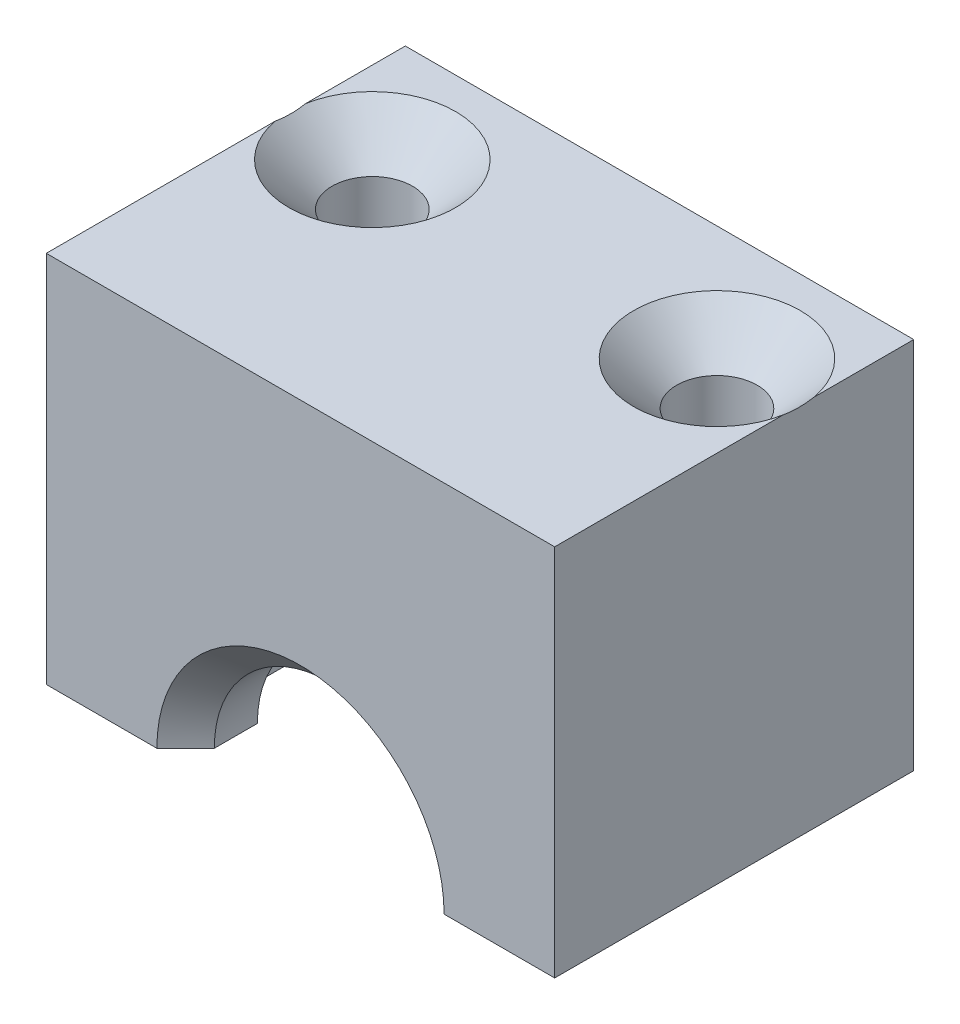
ISO-10303-21;
HEADER;
FILE_DESCRIPTION(('STEP AP214'),'2;1');
FILE_NAME('part.step','',(''),(''),'','','');
FILE_SCHEMA(('AUTOMOTIVE_DESIGN { 1 0 10303 214 1 1 1 1 }'));
ENDSEC;
DATA;
#1=APPLICATION_CONTEXT('core data for automotive mechanical design processes');
#2=APPLICATION_PROTOCOL_DEFINITION('international standard','automotive_design',2000,#1);
#3=PRODUCT_CONTEXT('',#1,'mechanical');
#4=PRODUCT('Part','Part','',(#3));
#5=PRODUCT_RELATED_PRODUCT_CATEGORY('part','',(#4));
#6=PRODUCT_DEFINITION_FORMATION('','',#4);
#7=PRODUCT_DEFINITION_CONTEXT('part definition',#1,'design');
#8=PRODUCT_DEFINITION('design','',#6,#7);
#9=PRODUCT_DEFINITION_SHAPE('','',#8);
#10=(LENGTH_UNIT() NAMED_UNIT(*) SI_UNIT(.MILLI.,.METRE.));
#11=(NAMED_UNIT(*) PLANE_ANGLE_UNIT() SI_UNIT($,.RADIAN.));
#12=(NAMED_UNIT(*) SI_UNIT($,.STERADIAN.) SOLID_ANGLE_UNIT());
#13=UNCERTAINTY_MEASURE_WITH_UNIT(LENGTH_MEASURE(1.E-05),#10,'distance_accuracy_value','');
#14=(GEOMETRIC_REPRESENTATION_CONTEXT(3) GLOBAL_UNCERTAINTY_ASSIGNED_CONTEXT((#13)) GLOBAL_UNIT_ASSIGNED_CONTEXT((#10,
#11,#12)) REPRESENTATION_CONTEXT('',''));
#15=CARTESIAN_POINT('',(0.,0.,0.));
#16=DIRECTION('',(0.,0.,1.));
#17=DIRECTION('',(1.,0.,0.));
#18=AXIS2_PLACEMENT_3D('',#15,#16,#17);
#19=CARTESIAN_POINT('',(-8.85,0.,6.25));
#20=DIRECTION('',(0.,1.,0.));
#21=DIRECTION('',(0.,0.,1.));
#22=AXIS2_PLACEMENT_3D('',#19,#20,#21);
#23=PLANE('',#22);
#24=CARTESIAN_POINT('',(-6.,0.,-2.25));
#25=DIRECTION('',(0.,1.,0.));
#26=DIRECTION('',(0.,0.,1.));
#27=AXIS2_PLACEMENT_3D('',#24,#25,#26);
#28=CIRCLE('',#27,1.4);
#29=CARTESIAN_POINT('',(-6.,0.,-0.85));
#30=VERTEX_POINT('',#29);
#31=EDGE_CURVE('E160',#30,#30,#28,.T.);
#32=ORIENTED_EDGE('',*,*,#31,.T.);
#33=EDGE_LOOP('',(#32));
#34=FACE_BOUND('',#33,.T.);
#35=DIRECTION('',(1.,0.,0.));
#36=VECTOR('',#35,1.);
#37=CARTESIAN_POINT('',(-8.85,0.,-6.25));
#38=LINE('',#37,#36);
#39=CARTESIAN_POINT('',(-8.85,0.,-6.25));
#40=VERTEX_POINT('',#39);
#41=CARTESIAN_POINT('',(-5.,0.,-6.25));
#42=VERTEX_POINT('',#41);
#43=EDGE_CURVE('E199',#40,#42,#38,.T.);
#44=ORIENTED_EDGE('',*,*,#43,.T.);
#45=DIRECTION('',(0.707106781186546,0.,0.707106781186549));
#46=VECTOR('',#45,1.);
#47=CARTESIAN_POINT('',(0.,0.,-1.24999999999999));
#48=LINE('',#47,#46);
#49=CARTESIAN_POINT('',(-4.,0.,-5.25));
#50=VERTEX_POINT('',#49);
#51=EDGE_CURVE('E226',#42,#50,#48,.T.);
#52=ORIENTED_EDGE('',*,*,#51,.T.);
#53=DIRECTION('',(0.,0.,1.));
#54=VECTOR('',#53,1.);
#55=CARTESIAN_POINT('',(-4.,0.,-6.25));
#56=LINE('',#55,#54);
#57=CARTESIAN_POINT('',(-4.,0.,-0.749999999999999));
#58=VERTEX_POINT('',#57);
#59=EDGE_CURVE('E180',#50,#58,#56,.T.);
#60=ORIENTED_EDGE('',*,*,#59,.T.);
#61=DIRECTION('',(1.,0.,0.));
#62=VECTOR('',#61,1.);
#63=CARTESIAN_POINT('',(-8.85,0.,-0.749999999999999));
#64=LINE('',#63,#62);
#65=CARTESIAN_POINT('',(-5.25,0.,-0.749999999999999));
#66=VERTEX_POINT('',#65);
#67=EDGE_CURVE('E172',#66,#58,#64,.T.);
#68=ORIENTED_EDGE('',*,*,#67,.F.);
#69=DIRECTION('',(0.,0.,1.));
#70=VECTOR('',#69,1.);
#71=CARTESIAN_POINT('',(-5.25,0.,-0.749999999999999));
#72=LINE('',#71,#70);
#73=CARTESIAN_POINT('',(-5.25,0.,3.75));
#74=VERTEX_POINT('',#73);
#75=EDGE_CURVE('E175',#66,#74,#72,.T.);
#76=ORIENTED_EDGE('',*,*,#75,.T.);
#77=DIRECTION('',(1.,0.,0.));
#78=VECTOR('',#77,1.);
#79=CARTESIAN_POINT('',(-8.85,0.,3.75));
#80=LINE('',#79,#78);
#81=CARTESIAN_POINT('',(-4.,0.,3.75));
#82=VERTEX_POINT('',#81);
#83=EDGE_CURVE('E159',#74,#82,#80,.T.);
#84=ORIENTED_EDGE('',*,*,#83,.T.);
#85=CARTESIAN_POINT('',(-4.,0.,5.25000000000001));
#86=VERTEX_POINT('',#85);
#87=EDGE_CURVE('E179',#82,#86,#56,.T.);
#88=ORIENTED_EDGE('',*,*,#87,.T.);
#89=DIRECTION('',(-0.707106781186549,0.,0.707106781186546));
#90=VECTOR('',#89,1.);
#91=CARTESIAN_POINT('',(0.,0.,1.25000000000002));
#92=LINE('',#91,#90);
#93=CARTESIAN_POINT('',(-5.,0.,6.25));
#94=VERTEX_POINT('',#93);
#95=EDGE_CURVE('E224',#86,#94,#92,.T.);
#96=ORIENTED_EDGE('',*,*,#95,.T.);
#97=DIRECTION('',(1.,0.,0.));
#98=VECTOR('',#97,1.);
#99=CARTESIAN_POINT('',(-8.85,0.,6.25));
#100=LINE('',#99,#98);
#101=CARTESIAN_POINT('',(-8.85,0.,6.25));
#102=VERTEX_POINT('',#101);
#103=EDGE_CURVE('E188',#102,#94,#100,.T.);
#104=ORIENTED_EDGE('',*,*,#103,.F.);
#105=DIRECTION('',(0.,0.,-1.));
#106=VECTOR('',#105,1.);
#107=CARTESIAN_POINT('',(-8.85,0.,6.25));
#108=LINE('',#107,#106);
#109=EDGE_CURVE('E216',#102,#40,#108,.T.);
#110=ORIENTED_EDGE('',*,*,#109,.T.);
#111=EDGE_LOOP('',(#44,#52,#60,#68,#76,#84,#88,#96,#104,#110));
#112=FACE_BOUND('',#111,.T.);
#113=ADVANCED_FACE('F35',(#34,#112),#23,.F.);
#114=CARTESIAN_POINT('',(6.,0.,-2.25));
#115=DIRECTION('',(0.,1.,0.));
#116=DIRECTION('',(0.,0.,1.));
#117=AXIS2_PLACEMENT_3D('',#114,#115,#116);
#118=CIRCLE('',#117,1.4);
#119=CARTESIAN_POINT('',(6.,0.,-0.850000000000002));
#120=VERTEX_POINT('',#119);
#121=EDGE_CURVE('E326',#120,#120,#118,.T.);
#122=ORIENTED_EDGE('',*,*,#121,.T.);
#123=EDGE_LOOP('',(#122));
#124=FACE_BOUND('',#123,.T.);
#125=DIRECTION('',(0.,0.,1.));
#126=VECTOR('',#125,1.);
#127=CARTESIAN_POINT('',(4.,0.,-6.25));
#128=LINE('',#127,#126);
#129=CARTESIAN_POINT('',(4.,0.,-0.749999999999999));
#130=VERTEX_POINT('',#129);
#131=CARTESIAN_POINT('',(4.,0.,-5.25));
#132=VERTEX_POINT('',#131);
#133=EDGE_CURVE('E177',#130,#132,#128,.F.);
#134=ORIENTED_EDGE('',*,*,#133,.T.);
#135=DIRECTION('',(0.707106781186546,0.,-0.707106781186549));
#136=VECTOR('',#135,1.);
#137=CARTESIAN_POINT('',(0.,0.,-1.24999999999999));
#138=LINE('',#137,#136);
#139=CARTESIAN_POINT('',(5.,0.,-6.25));
#140=VERTEX_POINT('',#139);
#141=EDGE_CURVE('E232',#132,#140,#138,.T.);
#142=ORIENTED_EDGE('',*,*,#141,.T.);
#143=CARTESIAN_POINT('',(8.85,0.,-6.25));
#144=VERTEX_POINT('',#143);
#145=EDGE_CURVE('E198',#140,#144,#38,.T.);
#146=ORIENTED_EDGE('',*,*,#145,.T.);
#147=DIRECTION('',(0.,0.,-1.));
#148=VECTOR('',#147,1.);
#149=CARTESIAN_POINT('',(8.85,0.,6.25));
#150=LINE('',#149,#148);
#151=CARTESIAN_POINT('',(8.85,0.,6.25));
#152=VERTEX_POINT('',#151);
#153=EDGE_CURVE('E213',#152,#144,#150,.T.);
#154=ORIENTED_EDGE('',*,*,#153,.F.);
#155=CARTESIAN_POINT('',(5.,0.,6.25));
#156=VERTEX_POINT('',#155);
#157=EDGE_CURVE('E186',#156,#152,#100,.T.);
#158=ORIENTED_EDGE('',*,*,#157,.F.);
#159=DIRECTION('',(-0.707106781186549,0.,-0.707106781186546));
#160=VECTOR('',#159,1.);
#161=CARTESIAN_POINT('',(0.,0.,1.25000000000002));
#162=LINE('',#161,#160);
#163=CARTESIAN_POINT('',(4.,0.,5.25000000000001));
#164=VERTEX_POINT('',#163);
#165=EDGE_CURVE('E230',#156,#164,#162,.T.);
#166=ORIENTED_EDGE('',*,*,#165,.T.);
#167=CARTESIAN_POINT('',(4.,0.,3.75));
#168=VERTEX_POINT('',#167);
#169=EDGE_CURVE('E165',#164,#168,#128,.F.);
#170=ORIENTED_EDGE('',*,*,#169,.T.);
#171=DIRECTION('',(1.,0.,0.));
#172=VECTOR('',#171,1.);
#173=CARTESIAN_POINT('',(-8.85,0.,3.75));
#174=LINE('',#173,#172);
#175=CARTESIAN_POINT('',(5.25,0.,3.75));
#176=VERTEX_POINT('',#175);
#177=EDGE_CURVE('E156',#168,#176,#174,.T.);
#178=ORIENTED_EDGE('',*,*,#177,.T.);
#179=DIRECTION('',(0.,0.,1.));
#180=VECTOR('',#179,1.);
#181=CARTESIAN_POINT('',(5.25,0.,-0.749999999999999));
#182=LINE('',#181,#180);
#183=CARTESIAN_POINT('',(5.25,0.,-0.749999999999999));
#184=VERTEX_POINT('',#183);
#185=EDGE_CURVE('E140',#176,#184,#182,.F.);
#186=ORIENTED_EDGE('',*,*,#185,.T.);
#187=DIRECTION('',(1.,0.,0.));
#188=VECTOR('',#187,1.);
#189=CARTESIAN_POINT('',(-8.85,0.,-0.749999999999999));
#190=LINE('',#189,#188);
#191=EDGE_CURVE('E167',#130,#184,#190,.T.);
#192=ORIENTED_EDGE('',*,*,#191,.F.);
#193=EDGE_LOOP('',(#134,#142,#146,#154,#158,#166,#170,#178,#186,#192));
#194=FACE_BOUND('',#193,.T.);
#195=ADVANCED_FACE('F163',(#124,#194),#23,.F.);
#196=CARTESIAN_POINT('',(0.,0.,-6.25));
#197=DIRECTION('',(0.,0.,1.));
#198=DIRECTION('',(1.,0.,0.));
#199=AXIS2_PLACEMENT_3D('',#196,#197,#198);
#200=CYLINDRICAL_SURFACE('',#199,4.);
#201=ORIENTED_EDGE('',*,*,#59,.F.);
#202=CARTESIAN_POINT('',(0.,0.,-5.25));
#203=DIRECTION('',(0.,0.,-1.));
#204=DIRECTION('',(-1.,0.,0.));
#205=AXIS2_PLACEMENT_3D('',#202,#203,#204);
#206=CIRCLE('',#205,4.);
#207=EDGE_CURVE('E228',#50,#132,#206,.T.);
#208=ORIENTED_EDGE('',*,*,#207,.T.);
#209=ORIENTED_EDGE('',*,*,#133,.F.);
#210=CARTESIAN_POINT('',(0.,0.,-0.749999999999999));
#211=DIRECTION('',(0.,0.,1.));
#212=DIRECTION('',(1.,0.,0.));
#213=AXIS2_PLACEMENT_3D('',#210,#211,#212);
#214=CIRCLE('',#213,4.);
#215=EDGE_CURVE('E151',#58,#130,#214,.F.);
#216=ORIENTED_EDGE('',*,*,#215,.F.);
#217=EDGE_LOOP('',(#201,#208,#209,#216));
#218=FACE_BOUND('',#217,.T.);
#219=ADVANCED_FACE('F261',(#218),#200,.F.);
#220=CARTESIAN_POINT('',(-8.85,0.,6.25));
#221=DIRECTION('',(1.,0.,0.));
#222=DIRECTION('',(0.,0.,-1.));
#223=AXIS2_PLACEMENT_3D('',#220,#221,#222);
#224=PLANE('',#223);
#225=DIRECTION('',(0.,0.,-1.));
#226=VECTOR('',#225,1.);
#227=CARTESIAN_POINT('',(-8.85,13.,6.25));
#228=LINE('',#227,#226);
#229=CARTESIAN_POINT('',(-8.85,13.,6.25));
#230=VERTEX_POINT('',#229);
#231=CARTESIAN_POINT('',(-8.85,13.,-1.71380973526175));
#232=VERTEX_POINT('',#231);
#233=EDGE_CURVE('E207',#230,#232,#228,.T.);
#234=ORIENTED_EDGE('',*,*,#233,.T.);
#235=CARTESIAN_POINT('',(-8.85,13.,-1.71380973526175));
#236=CARTESIAN_POINT('',(-8.85,12.986829252982,-1.78486152157712));
#237=CARTESIAN_POINT('',(-8.85,12.9761566820111,-1.85639533520071));
#238=CARTESIAN_POINT('',(-8.85,12.9600551575792,-2.00007826367478));
#239=CARTESIAN_POINT('',(-8.85,12.9546283839288,-2.07222762175339));
#240=CARTESIAN_POINT('',(-8.85,12.9493128169699,-2.21576814655994));
#241=CARTESIAN_POINT('',(-8.85,12.9493510206153,-2.28715656822919));
#242=CARTESIAN_POINT('',(-8.85,12.9547725215684,-2.42969681696473));
#243=CARTESIAN_POINT('',(-8.85,12.9601530929552,-2.50084874612347));
#244=CARTESIAN_POINT('',(-8.85,12.9721207621259,-2.60756314233051));
#245=CARTESIAN_POINT('',(-8.85,12.9768001837485,-2.6433506247089));
#246=CARTESIAN_POINT('',(-8.85,12.9874452317561,-2.71485985524653));
#247=CARTESIAN_POINT('',(-8.85,12.9934152264076,-2.75058095401));
#248=CARTESIAN_POINT('',(-8.85,13.,-2.78619026473825));
#249=B_SPLINE_CURVE_WITH_KNOTS('',3,(#235,#236,#237,#238,#239,#240,#241,#242,#243,#244,#245,
#246,#247,#248),.UNSPECIFIED.,.F.,.F.,(4,2,2,2,2,2,4),(0.,0.216771065104474,0.433632167426242,
0.647596638695988,0.861451991564657,0.96970874301651,1.07833781970982),.UNSPECIFIED.);
#250=CARTESIAN_POINT('',(-8.85,13.,-2.78619026473825));
#251=VERTEX_POINT('',#250);
#252=EDGE_CURVE('E247',#232,#251,#249,.T.);
#253=ORIENTED_EDGE('',*,*,#252,.T.);
#254=CARTESIAN_POINT('',(-8.85,13.,-6.25));
#255=VERTEX_POINT('',#254);
#256=EDGE_CURVE('E195',#251,#255,#228,.T.);
#257=ORIENTED_EDGE('',*,*,#256,.T.);
#258=DIRECTION('',(0.,-1.,0.));
#259=VECTOR('',#258,1.);
#260=CARTESIAN_POINT('',(-8.85,0.,-6.25));
#261=LINE('',#260,#259);
#262=EDGE_CURVE('E182',#255,#40,#261,.T.);
#263=ORIENTED_EDGE('',*,*,#262,.T.);
#264=ORIENTED_EDGE('',*,*,#109,.F.);
#265=DIRECTION('',(0.,-1.,0.));
#266=VECTOR('',#265,1.);
#267=CARTESIAN_POINT('',(-8.85,0.,6.25));
#268=LINE('',#267,#266);
#269=EDGE_CURVE('E183',#230,#102,#268,.T.);
#270=ORIENTED_EDGE('',*,*,#269,.F.);
#271=EDGE_LOOP('',(#234,#253,#257,#263,#264,#270));
#272=FACE_BOUND('',#271,.T.);
#273=ADVANCED_FACE('F255',(#272),#224,.F.);
#274=CARTESIAN_POINT('',(8.85,0.,6.25));
#275=DIRECTION('',(-1.,0.,0.));
#276=DIRECTION('',(0.,0.,1.));
#277=AXIS2_PLACEMENT_3D('',#274,#275,#276);
#278=PLANE('',#277);
#279=DIRECTION('',(0.,0.,-1.));
#280=VECTOR('',#279,1.);
#281=CARTESIAN_POINT('',(8.85,13.,6.25));
#282=LINE('',#281,#280);
#283=CARTESIAN_POINT('',(8.85,13.,-2.78619026473829));
#284=VERTEX_POINT('',#283);
#285=CARTESIAN_POINT('',(8.85,13.,-6.25));
#286=VERTEX_POINT('',#285);
#287=EDGE_CURVE('E210',#284,#286,#282,.T.);
#288=ORIENTED_EDGE('',*,*,#287,.F.);
#289=CARTESIAN_POINT('',(8.85,13.,-2.78619026473829));
#290=CARTESIAN_POINT('',(8.85,12.986829252982,-2.71513847842292));
#291=CARTESIAN_POINT('',(8.85,12.9761566820111,-2.64360466479933));
#292=CARTESIAN_POINT('',(8.85,12.9600551575792,-2.49992173632526));
#293=CARTESIAN_POINT('',(8.85,12.9546283839288,-2.42777237824664));
#294=CARTESIAN_POINT('',(8.85,12.9493128169699,-2.2842318534401));
#295=CARTESIAN_POINT('',(8.85,12.9493510206153,-2.21284343177085));
#296=CARTESIAN_POINT('',(8.85,12.9547725215684,-2.07030318303531));
#297=CARTESIAN_POINT('',(8.85,12.9601530929552,-1.99915125387657));
#298=CARTESIAN_POINT('',(8.85,12.9721207621259,-1.89243685766951));
#299=CARTESIAN_POINT('',(8.85,12.9768001837485,-1.85664937529111));
#300=CARTESIAN_POINT('',(8.85,12.9874452317561,-1.78514014475346));
#301=CARTESIAN_POINT('',(8.85,12.9934152264076,-1.74941904598997));
#302=CARTESIAN_POINT('',(8.85,13.,-1.71380973526171));
#303=B_SPLINE_CURVE_WITH_KNOTS('',3,(#289,#290,#291,#292,#293,#294,#295,#296,#297,#298,#299,
#300,#301,#302),.UNSPECIFIED.,.F.,.F.,(4,2,2,2,2,2,4),(0.,0.216771065104475,0.433632167426243,
0.64759663869599,0.861451991564658,0.969708743016549,1.0783378197099),.UNSPECIFIED.);
#304=CARTESIAN_POINT('',(8.85,13.,-1.71380973526171));
#305=VERTEX_POINT('',#304);
#306=EDGE_CURVE('E11',#284,#305,#303,.T.);
#307=ORIENTED_EDGE('',*,*,#306,.T.);
#308=CARTESIAN_POINT('',(8.85,13.,6.25));
#309=VERTEX_POINT('',#308);
#310=EDGE_CURVE('E211',#309,#305,#282,.T.);
#311=ORIENTED_EDGE('',*,*,#310,.F.);
#312=DIRECTION('',(0.,1.,0.));
#313=VECTOR('',#312,1.);
#314=CARTESIAN_POINT('',(8.85,0.,6.25));
#315=LINE('',#314,#313);
#316=EDGE_CURVE('E191',#152,#309,#315,.T.);
#317=ORIENTED_EDGE('',*,*,#316,.F.);
#318=ORIENTED_EDGE('',*,*,#153,.T.);
#319=DIRECTION('',(0.,1.,0.));
#320=VECTOR('',#319,1.);
#321=CARTESIAN_POINT('',(8.85,0.,-6.25));
#322=LINE('',#321,#320);
#323=EDGE_CURVE('E202',#144,#286,#322,.T.);
#324=ORIENTED_EDGE('',*,*,#323,.T.);
#325=EDGE_LOOP('',(#288,#307,#311,#317,#318,#324));
#326=FACE_BOUND('',#325,.T.);
#327=ADVANCED_FACE('F260',(#326),#278,.F.);
#328=CARTESIAN_POINT('',(-8.85,13.,6.25));
#329=DIRECTION('',(0.,-1.,0.));
#330=DIRECTION('',(0.,0.,-1.));
#331=AXIS2_PLACEMENT_3D('',#328,#329,#330);
#332=PLANE('',#331);
#333=ORIENTED_EDGE('',*,*,#256,.F.);
#334=CARTESIAN_POINT('',(-6.,13.,-2.25));
#335=DIRECTION('',(0.,-1.,0.));
#336=DIRECTION('',(0.,0.,-1.));
#337=AXIS2_PLACEMENT_3D('',#334,#335,#336);
#338=CIRCLE('',#337,2.90000000000001);
#339=EDGE_CURVE('E244',#251,#232,#338,.T.);
#340=ORIENTED_EDGE('',*,*,#339,.T.);
#341=ORIENTED_EDGE('',*,*,#233,.F.);
#342=DIRECTION('',(-1.,0.,0.));
#343=VECTOR('',#342,1.);
#344=CARTESIAN_POINT('',(-8.85,13.,6.25));
#345=LINE('',#344,#343);
#346=EDGE_CURVE('E193',#309,#230,#345,.T.);
#347=ORIENTED_EDGE('',*,*,#346,.F.);
#348=ORIENTED_EDGE('',*,*,#310,.T.);
#349=CARTESIAN_POINT('',(6.,13.,-2.25));
#350=DIRECTION('',(0.,-1.,0.));
#351=DIRECTION('',(0.,0.,-1.));
#352=AXIS2_PLACEMENT_3D('',#349,#350,#351);
#353=CIRCLE('',#352,2.90000000000002);
#354=EDGE_CURVE('E242',#305,#284,#353,.T.);
#355=ORIENTED_EDGE('',*,*,#354,.T.);
#356=ORIENTED_EDGE('',*,*,#287,.T.);
#357=DIRECTION('',(-1.,0.,0.));
#358=VECTOR('',#357,1.);
#359=CARTESIAN_POINT('',(-8.85,13.,-6.25));
#360=LINE('',#359,#358);
#361=EDGE_CURVE('E187',#286,#255,#360,.T.);
#362=ORIENTED_EDGE('',*,*,#361,.T.);
#363=EDGE_LOOP('',(#333,#340,#341,#347,#348,#355,#356,#362));
#364=FACE_BOUND('',#363,.T.);
#365=ADVANCED_FACE('F316',(#364),#332,.F.);
#366=CARTESIAN_POINT('',(0.,0.,6.25));
#367=DIRECTION('',(0.,0.,-1.));
#368=DIRECTION('',(-1.,0.,0.));
#369=AXIS2_PLACEMENT_3D('',#366,#367,#368);
#370=PLANE('',#369);
#371=ORIENTED_EDGE('',*,*,#103,.T.);
#372=CARTESIAN_POINT('',(0.,0.,6.25));
#373=DIRECTION('',(0.,0.,-1.));
#374=DIRECTION('',(-1.,0.,0.));
#375=AXIS2_PLACEMENT_3D('',#372,#373,#374);
#376=CIRCLE('',#375,5.);
#377=EDGE_CURVE('E237',#94,#156,#376,.T.);
#378=ORIENTED_EDGE('',*,*,#377,.T.);
#379=ORIENTED_EDGE('',*,*,#157,.T.);
#380=ORIENTED_EDGE('',*,*,#316,.T.);
#381=ORIENTED_EDGE('',*,*,#346,.T.);
#382=ORIENTED_EDGE('',*,*,#269,.T.);
#383=EDGE_LOOP('',(#371,#378,#379,#380,#381,#382));
#384=FACE_BOUND('',#383,.T.);
#385=ADVANCED_FACE('F308',(#384),#370,.F.);
#386=CARTESIAN_POINT('',(0.,0.,-6.25));
#387=DIRECTION('',(0.,0.,-1.));
#388=DIRECTION('',(-1.,0.,0.));
#389=AXIS2_PLACEMENT_3D('',#386,#387,#388);
#390=PLANE('',#389);
#391=ORIENTED_EDGE('',*,*,#145,.F.);
#392=CARTESIAN_POINT('',(0.,0.,-6.25));
#393=DIRECTION('',(0.,0.,-1.));
#394=DIRECTION('',(-1.,0.,0.));
#395=AXIS2_PLACEMENT_3D('',#392,#393,#394);
#396=CIRCLE('',#395,5.);
#397=EDGE_CURVE('E150',#140,#42,#396,.F.);
#398=ORIENTED_EDGE('',*,*,#397,.T.);
#399=ORIENTED_EDGE('',*,*,#43,.F.);
#400=ORIENTED_EDGE('',*,*,#262,.F.);
#401=ORIENTED_EDGE('',*,*,#361,.F.);
#402=ORIENTED_EDGE('',*,*,#323,.F.);
#403=EDGE_LOOP('',(#391,#398,#399,#400,#401,#402));
#404=FACE_BOUND('',#403,.T.);
#405=ADVANCED_FACE('F289',(#404),#390,.T.);
#406=ORIENTED_EDGE('',*,*,#169,.F.);
#407=CARTESIAN_POINT('',(0.,0.,5.25000000000001));
#408=DIRECTION('',(0.,0.,-1.));
#409=DIRECTION('',(-1.,0.,0.));
#410=AXIS2_PLACEMENT_3D('',#407,#408,#409);
#411=CIRCLE('',#410,4.);
#412=EDGE_CURVE('E234',#164,#86,#411,.F.);
#413=ORIENTED_EDGE('',*,*,#412,.T.);
#414=ORIENTED_EDGE('',*,*,#87,.F.);
#415=CARTESIAN_POINT('',(0.,0.,3.75));
#416=DIRECTION('',(0.,0.,1.));
#417=DIRECTION('',(1.,0.,0.));
#418=AXIS2_PLACEMENT_3D('',#415,#416,#417);
#419=CIRCLE('',#418,4.);
#420=EDGE_CURVE('E219',#82,#168,#419,.F.);
#421=ORIENTED_EDGE('',*,*,#420,.T.);
#422=EDGE_LOOP('',(#406,#413,#414,#421));
#423=FACE_BOUND('',#422,.T.);
#424=ADVANCED_FACE('F304',(#423),#200,.F.);
#425=CARTESIAN_POINT('',(0.,0.,-0.749999999999999));
#426=DIRECTION('',(0.,0.,1.));
#427=DIRECTION('',(1.,0.,0.));
#428=AXIS2_PLACEMENT_3D('',#425,#426,#427);
#429=CYLINDRICAL_SURFACE('',#428,5.25);
#430=CARTESIAN_POINT('',(0.,0.,-0.749999999999999));
#431=DIRECTION('',(0.,0.,1.));
#432=DIRECTION('',(1.,0.,0.));
#433=AXIS2_PLACEMENT_3D('',#430,#431,#432);
#434=CIRCLE('',#433,5.25);
#435=EDGE_CURVE('E146',#184,#66,#434,.T.);
#436=ORIENTED_EDGE('',*,*,#435,.F.);
#437=ORIENTED_EDGE('',*,*,#185,.F.);
#438=CARTESIAN_POINT('',(0.,0.,3.75));
#439=DIRECTION('',(0.,0.,1.));
#440=DIRECTION('',(1.,0.,0.));
#441=AXIS2_PLACEMENT_3D('',#438,#439,#440);
#442=CIRCLE('',#441,5.25);
#443=EDGE_CURVE('E143',#176,#74,#442,.T.);
#444=ORIENTED_EDGE('',*,*,#443,.T.);
#445=ORIENTED_EDGE('',*,*,#75,.F.);
#446=EDGE_LOOP('',(#436,#437,#444,#445));
#447=FACE_BOUND('',#446,.T.);
#448=ADVANCED_FACE('F142',(#447),#429,.F.);
#449=CARTESIAN_POINT('',(0.,0.,-0.749999999999999));
#450=DIRECTION('',(0.,0.,1.));
#451=DIRECTION('',(1.,0.,0.));
#452=AXIS2_PLACEMENT_3D('',#449,#450,#451);
#453=PLANE('',#452);
#454=ORIENTED_EDGE('',*,*,#67,.T.);
#455=ORIENTED_EDGE('',*,*,#215,.T.);
#456=ORIENTED_EDGE('',*,*,#191,.T.);
#457=ORIENTED_EDGE('',*,*,#435,.T.);
#458=EDGE_LOOP('',(#454,#455,#456,#457));
#459=FACE_BOUND('',#458,.T.);
#460=ADVANCED_FACE('F299',(#459),#453,.T.);
#461=CARTESIAN_POINT('',(0.,0.,3.75));
#462=DIRECTION('',(0.,0.,1.));
#463=DIRECTION('',(1.,0.,0.));
#464=AXIS2_PLACEMENT_3D('',#461,#462,#463);
#465=PLANE('',#464);
#466=ORIENTED_EDGE('',*,*,#443,.F.);
#467=ORIENTED_EDGE('',*,*,#177,.F.);
#468=ORIENTED_EDGE('',*,*,#420,.F.);
#469=ORIENTED_EDGE('',*,*,#83,.F.);
#470=EDGE_LOOP('',(#466,#467,#468,#469));
#471=FACE_BOUND('',#470,.T.);
#472=ADVANCED_FACE('F155',(#471),#465,.F.);
#473=CARTESIAN_POINT('',(-6.,0.,-2.25));
#474=DIRECTION('',(0.,1.,0.));
#475=DIRECTION('',(0.,0.,1.));
#476=AXIS2_PLACEMENT_3D('',#473,#474,#475);
#477=CYLINDRICAL_SURFACE('',#476,1.4);
#478=CARTESIAN_POINT('',(-6.,11.5,-2.25));
#479=DIRECTION('',(0.,-1.,0.));
#480=DIRECTION('',(0.,0.,-1.));
#481=AXIS2_PLACEMENT_3D('',#478,#479,#480);
#482=CIRCLE('',#481,1.4);
#483=CARTESIAN_POINT('',(-6.,11.5,-0.85));
#484=VERTEX_POINT('',#483);
#485=EDGE_CURVE('E239',#484,#484,#482,.F.);
#486=CARTESIAN_POINT('',(-6.,11.5,-0.85));
#487=CARTESIAN_POINT('',(-6.,11.3802083333333,-0.85));
#488=CARTESIAN_POINT('',(-6.,11.2604166666667,-0.85));
#489=CARTESIAN_POINT('',(-6.,11.0208333333333,-0.85));
#490=CARTESIAN_POINT('',(-6.,10.9010416666667,-0.85));
#491=CARTESIAN_POINT('',(-6.,10.6614583333333,-0.85));
#492=CARTESIAN_POINT('',(-6.,10.5416666666667,-0.85));
#493=CARTESIAN_POINT('',(-6.,10.3020833333333,-0.85));
#494=CARTESIAN_POINT('',(-6.,10.1822916666667,-0.85));
#495=CARTESIAN_POINT('',(-6.,9.94270833333333,-0.85));
#496=CARTESIAN_POINT('',(-6.,9.82291666666666,-0.85));
#497=CARTESIAN_POINT('',(-6.,9.58333333333333,-0.85));
#498=CARTESIAN_POINT('',(-6.,9.46354166666666,-0.85));
#499=CARTESIAN_POINT('',(-6.,9.22395833333333,-0.85));
#500=CARTESIAN_POINT('',(-6.,9.10416666666666,-0.85));
#501=CARTESIAN_POINT('',(-6.,8.86458333333333,-0.85));
#502=CARTESIAN_POINT('',(-6.,8.74479166666666,-0.85));
#503=CARTESIAN_POINT('',(-6.,8.50520833333333,-0.85));
#504=CARTESIAN_POINT('',(-6.,8.38541666666666,-0.85));
#505=CARTESIAN_POINT('',(-6.,8.14583333333333,-0.85));
#506=CARTESIAN_POINT('',(-6.,8.02604166666666,-0.85));
#507=CARTESIAN_POINT('',(-6.,7.78645833333333,-0.85));
#508=CARTESIAN_POINT('',(-6.,7.66666666666666,-0.85));
#509=CARTESIAN_POINT('',(-6.,7.42708333333333,-0.85));
#510=CARTESIAN_POINT('',(-6.,7.30729166666666,-0.85));
#511=CARTESIAN_POINT('',(-6.,7.06770833333333,-0.85));
#512=CARTESIAN_POINT('',(-6.,6.94791666666666,-0.85));
#513=CARTESIAN_POINT('',(-6.,6.70833333333333,-0.85));
#514=CARTESIAN_POINT('',(-6.,6.58854166666666,-0.85));
#515=CARTESIAN_POINT('',(-6.,6.34895833333333,-0.85));
#516=CARTESIAN_POINT('',(-6.,6.22916666666666,-0.85));
#517=CARTESIAN_POINT('',(-6.,5.98958333333333,-0.85));
#518=CARTESIAN_POINT('',(-6.,5.86979166666666,-0.85));
#519=CARTESIAN_POINT('',(-6.,5.63020833333333,-0.85));
#520=CARTESIAN_POINT('',(-6.,5.51041666666666,-0.85));
#521=CARTESIAN_POINT('',(-6.,5.27083333333333,-0.85));
#522=CARTESIAN_POINT('',(-6.,5.15104166666666,-0.85));
#523=CARTESIAN_POINT('',(-6.,4.91145833333333,-0.85));
#524=CARTESIAN_POINT('',(-6.,4.79166666666666,-0.85));
#525=CARTESIAN_POINT('',(-6.,4.55208333333333,-0.85));
#526=CARTESIAN_POINT('',(-6.,4.43229166666666,-0.85));
#527=CARTESIAN_POINT('',(-6.,4.19270833333333,-0.85));
#528=CARTESIAN_POINT('',(-6.,4.07291666666666,-0.85));
#529=CARTESIAN_POINT('',(-6.,3.83333333333333,-0.85));
#530=CARTESIAN_POINT('',(-6.,3.71354166666666,-0.85));
#531=CARTESIAN_POINT('',(-6.,3.47395833333333,-0.85));
#532=CARTESIAN_POINT('',(-6.,3.35416666666666,-0.85));
#533=CARTESIAN_POINT('',(-6.,3.11458333333333,-0.85));
#534=CARTESIAN_POINT('',(-6.,2.99479166666666,-0.85));
#535=CARTESIAN_POINT('',(-6.,2.75520833333333,-0.85));
#536=CARTESIAN_POINT('',(-6.,2.63541666666667,-0.85));
#537=CARTESIAN_POINT('',(-6.,2.39583333333333,-0.85));
#538=CARTESIAN_POINT('',(-6.,2.27604166666666,-0.85));
#539=CARTESIAN_POINT('',(-6.,2.03645833333333,-0.85));
#540=CARTESIAN_POINT('',(-6.,1.91666666666666,-0.85));
#541=CARTESIAN_POINT('',(-6.,1.67708333333333,-0.85));
#542=CARTESIAN_POINT('',(-6.,1.55729166666667,-0.85));
#543=CARTESIAN_POINT('',(-6.,1.31770833333333,-0.85));
#544=CARTESIAN_POINT('',(-6.,1.19791666666667,-0.85));
#545=CARTESIAN_POINT('',(-6.,0.958333333333332,-0.85));
#546=CARTESIAN_POINT('',(-6.,0.838541666666666,-0.85));
#547=CARTESIAN_POINT('',(-6.,0.598958333333333,-0.85));
#548=CARTESIAN_POINT('',(-6.,0.479166666666666,-0.85));
#549=CARTESIAN_POINT('',(-6.,0.239583333333334,-0.85));
#550=CARTESIAN_POINT('',(-6.,0.119791666666667,-0.85));
#551=CARTESIAN_POINT('',(-6.,0.,-0.85));
#552=B_SPLINE_CURVE_WITH_KNOTS('',3,(#486,#487,#488,#489,#490,#491,#492,#493,#494,#495,#496,
#497,#498,#499,#500,#501,#502,#503,#504,#505,#506,#507,#508,#509,#510,#511,#512,#513,#514,#515,
#516,#517,#518,#519,#520,#521,#522,#523,#524,#525,#526,#527,#528,#529,#530,#531,#532,#533,#534,
#535,#536,#537,#538,#539,#540,#541,#542,#543,#544,#545,#546,#547,#548,#549,#550,#551),
.UNSPECIFIED.,.F.,.F.,(4,2,2,2,2,2,2,2,2,2,2,2,2,2,2,2,2,2,2,2,2,2,2,2,2,2,2,2,2,2,2,2,4),(0.,
0.359375,0.718749999999999,1.078125,1.4375,1.796875,2.15625,2.515625,2.875,3.234375,3.59375,
3.953125,4.3125,4.671875,5.03125,5.390625,5.75,6.10937499999999,6.46875,6.82812499999999,
7.18749999999999,7.54687499999999,7.90624999999999,8.26562499999999,8.62499999999999,
8.98437499999999,9.34374999999999,9.70312499999999,10.0625,10.421875,10.78125,11.140625,11.5),.UNSPECIFIED.);
#553=EDGE_CURVE('BSEAM322',#484,#30,#552,.T.);
#554=ORIENTED_EDGE('',*,*,#485,.T.);
#555=ORIENTED_EDGE('',*,*,#31,.F.);
#556=ORIENTED_EDGE('',*,*,#553,.T.);
#557=ORIENTED_EDGE('',*,*,#553,.F.);
#558=EDGE_LOOP('',(#554,#556,#555,#557));
#559=FACE_BOUND('',#558,.T.);
#560=ADVANCED_FACE('F322',(#559),#477,.F.);
#561=CARTESIAN_POINT('',(6.,0.,-2.25));
#562=DIRECTION('',(0.,1.,0.));
#563=DIRECTION('',(0.,0.,1.));
#564=AXIS2_PLACEMENT_3D('',#561,#562,#563);
#565=CYLINDRICAL_SURFACE('',#564,1.4);
#566=CARTESIAN_POINT('',(6.,11.5,-2.25));
#567=DIRECTION('',(0.,-1.,0.));
#568=DIRECTION('',(0.,0.,-1.));
#569=AXIS2_PLACEMENT_3D('',#566,#567,#568);
#570=CIRCLE('',#569,1.4);
#571=CARTESIAN_POINT('',(6.,11.5,-0.850000000000002));
#572=VERTEX_POINT('',#571);
#573=EDGE_CURVE('E48',#572,#572,#570,.F.);
#574=CARTESIAN_POINT('',(6.,11.5,-0.850000000000002));
#575=CARTESIAN_POINT('',(6.,11.3802083333333,-0.850000000000002));
#576=CARTESIAN_POINT('',(6.,11.2604166666667,-0.850000000000002));
#577=CARTESIAN_POINT('',(6.,11.0208333333333,-0.850000000000002));
#578=CARTESIAN_POINT('',(6.,10.9010416666667,-0.850000000000002));
#579=CARTESIAN_POINT('',(6.,10.6614583333333,-0.850000000000002));
#580=CARTESIAN_POINT('',(6.,10.5416666666667,-0.850000000000002));
#581=CARTESIAN_POINT('',(6.,10.3020833333333,-0.850000000000002));
#582=CARTESIAN_POINT('',(6.,10.1822916666667,-0.850000000000002));
#583=CARTESIAN_POINT('',(6.,9.94270833333332,-0.850000000000002));
#584=CARTESIAN_POINT('',(6.,9.82291666666665,-0.850000000000002));
#585=CARTESIAN_POINT('',(6.,9.58333333333332,-0.850000000000002));
#586=CARTESIAN_POINT('',(6.,9.46354166666665,-0.850000000000002));
#587=CARTESIAN_POINT('',(6.,9.22395833333332,-0.850000000000002));
#588=CARTESIAN_POINT('',(6.,9.10416666666665,-0.850000000000002));
#589=CARTESIAN_POINT('',(6.,8.86458333333332,-0.850000000000002));
#590=CARTESIAN_POINT('',(6.,8.74479166666665,-0.850000000000002));
#591=CARTESIAN_POINT('',(6.,8.50520833333332,-0.850000000000002));
#592=CARTESIAN_POINT('',(6.,8.38541666666666,-0.850000000000002));
#593=CARTESIAN_POINT('',(6.,8.14583333333332,-0.850000000000002));
#594=CARTESIAN_POINT('',(6.,8.02604166666666,-0.850000000000002));
#595=CARTESIAN_POINT('',(6.,7.78645833333332,-0.850000000000002));
#596=CARTESIAN_POINT('',(6.,7.66666666666666,-0.850000000000002));
#597=CARTESIAN_POINT('',(6.,7.42708333333332,-0.850000000000002));
#598=CARTESIAN_POINT('',(6.,7.30729166666666,-0.850000000000002));
#599=CARTESIAN_POINT('',(6.,7.06770833333332,-0.850000000000002));
#600=CARTESIAN_POINT('',(6.,6.94791666666666,-0.850000000000002));
#601=CARTESIAN_POINT('',(6.,6.70833333333332,-0.850000000000002));
#602=CARTESIAN_POINT('',(6.,6.58854166666666,-0.850000000000002));
#603=CARTESIAN_POINT('',(6.,6.34895833333332,-0.850000000000002));
#604=CARTESIAN_POINT('',(6.,6.22916666666666,-0.850000000000002));
#605=CARTESIAN_POINT('',(6.,5.98958333333333,-0.850000000000002));
#606=CARTESIAN_POINT('',(6.,5.86979166666666,-0.850000000000002));
#607=CARTESIAN_POINT('',(6.,5.63020833333333,-0.850000000000002));
#608=CARTESIAN_POINT('',(6.,5.51041666666666,-0.850000000000002));
#609=CARTESIAN_POINT('',(6.,5.27083333333333,-0.850000000000002));
#610=CARTESIAN_POINT('',(6.,5.15104166666666,-0.850000000000002));
#611=CARTESIAN_POINT('',(6.,4.91145833333333,-0.850000000000002));
#612=CARTESIAN_POINT('',(6.,4.79166666666666,-0.850000000000002));
#613=CARTESIAN_POINT('',(6.,4.55208333333333,-0.850000000000002));
#614=CARTESIAN_POINT('',(6.,4.43229166666666,-0.850000000000002));
#615=CARTESIAN_POINT('',(6.,4.19270833333333,-0.850000000000002));
#616=CARTESIAN_POINT('',(6.,4.07291666666666,-0.850000000000002));
#617=CARTESIAN_POINT('',(6.,3.83333333333333,-0.850000000000002));
#618=CARTESIAN_POINT('',(6.,3.71354166666666,-0.850000000000002));
#619=CARTESIAN_POINT('',(6.,3.47395833333333,-0.850000000000002));
#620=CARTESIAN_POINT('',(6.,3.35416666666666,-0.850000000000002));
#621=CARTESIAN_POINT('',(6.,3.11458333333333,-0.850000000000002));
#622=CARTESIAN_POINT('',(6.,2.99479166666666,-0.850000000000002));
#623=CARTESIAN_POINT('',(6.,2.75520833333333,-0.850000000000002));
#624=CARTESIAN_POINT('',(6.,2.63541666666666,-0.850000000000002));
#625=CARTESIAN_POINT('',(6.,2.39583333333333,-0.850000000000002));
#626=CARTESIAN_POINT('',(6.,2.27604166666666,-0.850000000000002));
#627=CARTESIAN_POINT('',(6.,2.03645833333333,-0.850000000000002));
#628=CARTESIAN_POINT('',(6.,1.91666666666666,-0.850000000000002));
#629=CARTESIAN_POINT('',(6.,1.67708333333333,-0.850000000000002));
#630=CARTESIAN_POINT('',(6.,1.55729166666666,-0.850000000000002));
#631=CARTESIAN_POINT('',(6.,1.31770833333333,-0.850000000000002));
#632=CARTESIAN_POINT('',(6.,1.19791666666667,-0.850000000000002));
#633=CARTESIAN_POINT('',(6.,0.958333333333332,-0.850000000000002));
#634=CARTESIAN_POINT('',(6.,0.838541666666666,-0.850000000000002));
#635=CARTESIAN_POINT('',(6.,0.598958333333333,-0.850000000000002));
#636=CARTESIAN_POINT('',(6.,0.479166666666666,-0.850000000000002));
#637=CARTESIAN_POINT('',(6.,0.239583333333334,-0.850000000000002));
#638=CARTESIAN_POINT('',(6.,0.119791666666667,-0.850000000000002));
#639=CARTESIAN_POINT('',(6.,0.,-0.850000000000002));
#640=B_SPLINE_CURVE_WITH_KNOTS('',3,(#574,#575,#576,#577,#578,#579,#580,#581,#582,#583,#584,
#585,#586,#587,#588,#589,#590,#591,#592,#593,#594,#595,#596,#597,#598,#599,#600,#601,#602,#603,
#604,#605,#606,#607,#608,#609,#610,#611,#612,#613,#614,#615,#616,#617,#618,#619,#620,#621,#622,
#623,#624,#625,#626,#627,#628,#629,#630,#631,#632,#633,#634,#635,#636,#637,#638,#639),
.UNSPECIFIED.,.F.,.F.,(4,2,2,2,2,2,2,2,2,2,2,2,2,2,2,2,2,2,2,2,2,2,2,2,2,2,2,2,2,2,2,2,4),(0.,
0.359375,0.718749999999999,1.078125,1.4375,1.796875,2.15625,2.515625,2.875,3.234375,3.59375,
3.95312499999999,4.31249999999999,4.67187499999999,5.03124999999999,5.39062499999999,
5.74999999999999,6.10937499999999,6.46874999999999,6.82812499999999,7.18749999999999,
7.54687499999999,7.90624999999999,8.26562499999999,8.62499999999999,8.98437499999999,
9.34374999999999,9.70312499999999,10.0625,10.421875,10.78125,11.140625,11.5),.UNSPECIFIED.);
#641=EDGE_CURVE('BSEAM266',#572,#120,#640,.T.);
#642=ORIENTED_EDGE('',*,*,#573,.T.);
#643=ORIENTED_EDGE('',*,*,#121,.F.);
#644=ORIENTED_EDGE('',*,*,#641,.T.);
#645=ORIENTED_EDGE('',*,*,#641,.F.);
#646=EDGE_LOOP('',(#642,#644,#643,#645));
#647=FACE_BOUND('',#646,.T.);
#648=ADVANCED_FACE('F266',(#647),#565,.F.);
#649=CARTESIAN_POINT('',(0.,0.,-6.25));
#650=DIRECTION('',(0.,0.,-1.));
#651=DIRECTION('',(-1.,0.,0.));
#652=AXIS2_PLACEMENT_3D('',#649,#650,#651);
#653=CONICAL_SURFACE('',#652,5.,0.785398163397447);
#654=ORIENTED_EDGE('',*,*,#141,.F.);
#655=ORIENTED_EDGE('',*,*,#207,.F.);
#656=ORIENTED_EDGE('',*,*,#51,.F.);
#657=ORIENTED_EDGE('',*,*,#397,.F.);
#658=EDGE_LOOP('',(#654,#655,#656,#657));
#659=FACE_BOUND('',#658,.T.);
#660=ADVANCED_FACE('F263',(#659),#653,.F.);
#661=CARTESIAN_POINT('',(0.,0.,5.25000000000001));
#662=DIRECTION('',(0.,0.,1.));
#663=DIRECTION('',(1.,0.,0.));
#664=AXIS2_PLACEMENT_3D('',#661,#662,#663);
#665=CONICAL_SURFACE('',#664,4.,0.78539816339745);
#666=ORIENTED_EDGE('',*,*,#165,.F.);
#667=ORIENTED_EDGE('',*,*,#377,.F.);
#668=ORIENTED_EDGE('',*,*,#95,.F.);
#669=ORIENTED_EDGE('',*,*,#412,.F.);
#670=EDGE_LOOP('',(#666,#667,#668,#669));
#671=FACE_BOUND('',#670,.T.);
#672=ADVANCED_FACE('F265',(#671),#665,.F.);
#673=CARTESIAN_POINT('',(-6.,11.5,-2.25));
#674=DIRECTION('',(0.,1.,0.));
#675=DIRECTION('',(0.,0.,1.));
#676=AXIS2_PLACEMENT_3D('',#673,#674,#675);
#677=CONICAL_SURFACE('',#676,1.4,0.785398163397449);
#678=ORIENTED_EDGE('',*,*,#252,.F.);
#679=ORIENTED_EDGE('',*,*,#339,.F.);
#680=EDGE_LOOP('',(#678,#679));
#681=FACE_BOUND('',#680,.T.);
#682=ORIENTED_EDGE('',*,*,#485,.F.);
#683=EDGE_LOOP('',(#682));
#684=FACE_BOUND('',#683,.T.);
#685=ADVANCED_FACE('F252',(#681,#684),#677,.F.);
#686=CARTESIAN_POINT('',(6.,11.5,-2.25));
#687=DIRECTION('',(0.,1.,0.));
#688=DIRECTION('',(0.,0.,1.));
#689=AXIS2_PLACEMENT_3D('',#686,#687,#688);
#690=CONICAL_SURFACE('',#689,1.4,0.785398163397451);
#691=ORIENTED_EDGE('',*,*,#306,.F.);
#692=ORIENTED_EDGE('',*,*,#354,.F.);
#693=EDGE_LOOP('',(#691,#692));
#694=FACE_BOUND('',#693,.T.);
#695=ORIENTED_EDGE('',*,*,#573,.F.);
#696=EDGE_LOOP('',(#695));
#697=FACE_BOUND('',#696,.T.);
#698=ADVANCED_FACE('F37',(#694,#697),#690,.F.);
#699=CLOSED_SHELL('',(#113,#195,#219,#273,#327,#365,#385,#405,#424,#448,#460,#472,#560,#648,
#660,#672,#685,#698));
#700=MANIFOLD_SOLID_BREP('B2',#699);
#701=ADVANCED_BREP_SHAPE_REPRESENTATION('',(#18,#700),#14);
#702=SHAPE_DEFINITION_REPRESENTATION(#9,#701);
ENDSEC;
END-ISO-10303-21;
